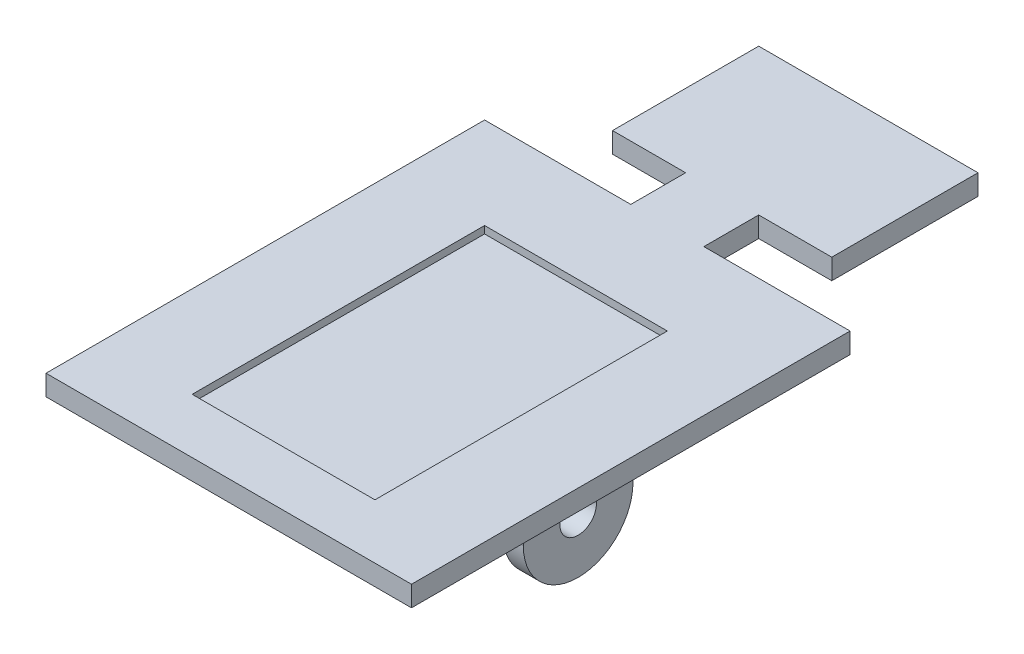
ISO-10303-21;
HEADER;
FILE_DESCRIPTION(('STEP AP214'),'2;1');
FILE_NAME('part.step','',(''),(''),'','','');
FILE_SCHEMA(('AUTOMOTIVE_DESIGN { 1 0 10303 214 1 1 1 1 }'));
ENDSEC;
DATA;
#1=APPLICATION_CONTEXT('core data for automotive mechanical design processes');
#2=APPLICATION_PROTOCOL_DEFINITION('international standard','automotive_design',2000,#1);
#3=PRODUCT_CONTEXT('',#1,'mechanical');
#4=PRODUCT('Part','Part','',(#3));
#5=PRODUCT_RELATED_PRODUCT_CATEGORY('part','',(#4));
#6=PRODUCT_DEFINITION_FORMATION('','',#4);
#7=PRODUCT_DEFINITION_CONTEXT('part definition',#1,'design');
#8=PRODUCT_DEFINITION('design','',#6,#7);
#9=PRODUCT_DEFINITION_SHAPE('','',#8);
#10=(LENGTH_UNIT() NAMED_UNIT(*) SI_UNIT(.MILLI.,.METRE.));
#11=(NAMED_UNIT(*) PLANE_ANGLE_UNIT() SI_UNIT($,.RADIAN.));
#12=(NAMED_UNIT(*) SI_UNIT($,.STERADIAN.) SOLID_ANGLE_UNIT());
#13=UNCERTAINTY_MEASURE_WITH_UNIT(LENGTH_MEASURE(1.E-05),#10,'distance_accuracy_value','');
#14=(GEOMETRIC_REPRESENTATION_CONTEXT(3) GLOBAL_UNCERTAINTY_ASSIGNED_CONTEXT((#13)) GLOBAL_UNIT_ASSIGNED_CONTEXT((#10,
#11,#12)) REPRESENTATION_CONTEXT('',''));
#15=CARTESIAN_POINT('',(0.,0.,0.));
#16=DIRECTION('',(0.,0.,1.));
#17=DIRECTION('',(1.,0.,0.));
#18=AXIS2_PLACEMENT_3D('',#15,#16,#17);
#19=CARTESIAN_POINT('',(17.8,-15.,22.5));
#20=DIRECTION('',(-1.,0.,0.));
#21=DIRECTION('',(0.,0.,1.));
#22=AXIS2_PLACEMENT_3D('',#19,#20,#21);
#23=PLANE('',#22);
#24=DIRECTION('',(0.,1.,0.));
#25=VECTOR('',#24,1.);
#26=CARTESIAN_POINT('',(17.8,-15.,37.5));
#27=LINE('',#26,#25);
#28=CARTESIAN_POINT('',(17.8,-7.5,37.5));
#29=VERTEX_POINT('',#28);
#30=CARTESIAN_POINT('',(17.8,0.,37.5));
#31=VERTEX_POINT('',#30);
#32=EDGE_CURVE('E241',#29,#31,#27,.T.);
#33=ORIENTED_EDGE('',*,*,#32,.F.);
#34=CARTESIAN_POINT('',(17.8,-7.5,30.));
#35=DIRECTION('',(-1.,0.,0.));
#36=DIRECTION('',(0.,0.,1.));
#37=AXIS2_PLACEMENT_3D('',#34,#35,#36);
#38=CIRCLE('',#37,7.5);
#39=CARTESIAN_POINT('',(17.8,-7.5,22.5));
#40=VERTEX_POINT('',#39);
#41=EDGE_CURVE('E703',#29,#40,#38,.F.);
#42=ORIENTED_EDGE('',*,*,#41,.T.);
#43=DIRECTION('',(0.,1.,0.));
#44=VECTOR('',#43,1.);
#45=CARTESIAN_POINT('',(17.8,-15.,22.5));
#46=LINE('',#45,#44);
#47=CARTESIAN_POINT('',(17.8,0.,22.5));
#48=VERTEX_POINT('',#47);
#49=EDGE_CURVE('E235',#40,#48,#46,.T.);
#50=ORIENTED_EDGE('',*,*,#49,.T.);
#51=DIRECTION('',(0.,0.,1.));
#52=VECTOR('',#51,1.);
#53=CARTESIAN_POINT('',(17.8,0.,22.5));
#54=LINE('',#53,#52);
#55=EDGE_CURVE('E218',#48,#31,#54,.T.);
#56=ORIENTED_EDGE('',*,*,#55,.T.);
#57=EDGE_LOOP('',(#33,#42,#50,#56));
#58=FACE_BOUND('',#57,.T.);
#59=CARTESIAN_POINT('',(17.8,-7.5,30.));
#60=DIRECTION('',(-1.,0.,0.));
#61=DIRECTION('',(0.,0.,1.));
#62=AXIS2_PLACEMENT_3D('',#59,#60,#61);
#63=CIRCLE('',#62,2.5);
#64=CARTESIAN_POINT('',(17.8,-7.5,32.5));
#65=VERTEX_POINT('',#64);
#66=EDGE_CURVE('E700',#65,#65,#63,.T.);
#67=ORIENTED_EDGE('',*,*,#66,.T.);
#68=EDGE_LOOP('',(#67));
#69=FACE_BOUND('',#68,.T.);
#70=ADVANCED_FACE('F33',(#58,#69),#23,.F.);
#71=CARTESIAN_POINT('',(15.,-15.,37.5));
#72=DIRECTION('',(0.,0.,-1.));
#73=DIRECTION('',(-1.,0.,0.));
#74=AXIS2_PLACEMENT_3D('',#71,#72,#73);
#75=PLANE('',#74);
#76=DIRECTION('',(1.,0.,0.));
#77=VECTOR('',#76,1.);
#78=CARTESIAN_POINT('',(-25.,-7.5,37.5));
#79=LINE('',#78,#77);
#80=CARTESIAN_POINT('',(15.,-7.5,37.5));
#81=VERTEX_POINT('',#80);
#82=EDGE_CURVE('E201',#81,#29,#79,.T.);
#83=ORIENTED_EDGE('',*,*,#82,.T.);
#84=ORIENTED_EDGE('',*,*,#32,.T.);
#85=DIRECTION('',(-1.,0.,0.));
#86=VECTOR('',#85,1.);
#87=CARTESIAN_POINT('',(15.,0.,37.5));
#88=LINE('',#87,#86);
#89=CARTESIAN_POINT('',(15.,0.,37.5));
#90=VERTEX_POINT('',#89);
#91=EDGE_CURVE('E226',#31,#90,#88,.T.);
#92=ORIENTED_EDGE('',*,*,#91,.T.);
#93=DIRECTION('',(0.,1.,0.));
#94=VECTOR('',#93,1.);
#95=CARTESIAN_POINT('',(15.,-15.,37.5));
#96=LINE('',#95,#94);
#97=EDGE_CURVE('E239',#81,#90,#96,.T.);
#98=ORIENTED_EDGE('',*,*,#97,.F.);
#99=EDGE_LOOP('',(#83,#84,#92,#98));
#100=FACE_BOUND('',#99,.T.);
#101=ADVANCED_FACE('F427',(#100),#75,.F.);
#102=CARTESIAN_POINT('',(15.,-15.,22.5));
#103=DIRECTION('',(1.,0.,0.));
#104=DIRECTION('',(0.,0.,-1.));
#105=AXIS2_PLACEMENT_3D('',#102,#103,#104);
#106=PLANE('',#105);
#107=DIRECTION('',(0.,1.,0.));
#108=VECTOR('',#107,1.);
#109=CARTESIAN_POINT('',(15.,-15.,22.5));
#110=LINE('',#109,#108);
#111=CARTESIAN_POINT('',(15.,-7.5,22.5));
#112=VERTEX_POINT('',#111);
#113=CARTESIAN_POINT('',(15.,0.,22.5));
#114=VERTEX_POINT('',#113);
#115=EDGE_CURVE('E237',#112,#114,#110,.T.);
#116=ORIENTED_EDGE('',*,*,#115,.F.);
#117=CARTESIAN_POINT('',(15.,-7.5,30.));
#118=DIRECTION('',(1.,0.,0.));
#119=DIRECTION('',(0.,0.,-1.));
#120=AXIS2_PLACEMENT_3D('',#117,#118,#119);
#121=CIRCLE('',#120,7.5);
#122=EDGE_CURVE('E49',#112,#81,#121,.F.);
#123=ORIENTED_EDGE('',*,*,#122,.T.);
#124=ORIENTED_EDGE('',*,*,#97,.T.);
#125=DIRECTION('',(0.,0.,-1.));
#126=VECTOR('',#125,1.);
#127=CARTESIAN_POINT('',(15.,0.,22.5));
#128=LINE('',#127,#126);
#129=EDGE_CURVE('E229',#90,#114,#128,.T.);
#130=ORIENTED_EDGE('',*,*,#129,.T.);
#131=EDGE_LOOP('',(#116,#123,#124,#130));
#132=FACE_BOUND('',#131,.T.);
#133=CARTESIAN_POINT('',(15.,-7.5,30.));
#134=DIRECTION('',(1.,0.,0.));
#135=DIRECTION('',(0.,0.,-1.));
#136=AXIS2_PLACEMENT_3D('',#133,#134,#135);
#137=CIRCLE('',#136,2.5);
#138=CARTESIAN_POINT('',(15.,-7.5,27.5));
#139=VERTEX_POINT('',#138);
#140=EDGE_CURVE('E697',#139,#139,#137,.T.);
#141=ORIENTED_EDGE('',*,*,#140,.T.);
#142=EDGE_LOOP('',(#141));
#143=FACE_BOUND('',#142,.T.);
#144=ADVANCED_FACE('F433',(#132,#143),#106,.F.);
#145=CARTESIAN_POINT('',(-15.,-15.,22.5));
#146=DIRECTION('',(-1.,0.,0.));
#147=DIRECTION('',(0.,0.,1.));
#148=AXIS2_PLACEMENT_3D('',#145,#146,#147);
#149=PLANE('',#148);
#150=DIRECTION('',(0.,1.,0.));
#151=VECTOR('',#150,1.);
#152=CARTESIAN_POINT('',(-15.,-15.,37.5));
#153=LINE('',#152,#151);
#154=CARTESIAN_POINT('',(-15.,-7.5,37.5));
#155=VERTEX_POINT('',#154);
#156=CARTESIAN_POINT('',(-15.,0.,37.5));
#157=VERTEX_POINT('',#156);
#158=EDGE_CURVE('E216',#155,#157,#153,.T.);
#159=ORIENTED_EDGE('',*,*,#158,.F.);
#160=CARTESIAN_POINT('',(-15.,-7.5,30.));
#161=DIRECTION('',(-1.,0.,0.));
#162=DIRECTION('',(0.,0.,1.));
#163=AXIS2_PLACEMENT_3D('',#160,#161,#162);
#164=CIRCLE('',#163,7.5);
#165=CARTESIAN_POINT('',(-15.,-7.5,22.5));
#166=VERTEX_POINT('',#165);
#167=EDGE_CURVE('E197',#155,#166,#164,.F.);
#168=ORIENTED_EDGE('',*,*,#167,.T.);
#169=DIRECTION('',(0.,1.,0.));
#170=VECTOR('',#169,1.);
#171=CARTESIAN_POINT('',(-15.,-15.,22.5));
#172=LINE('',#171,#170);
#173=CARTESIAN_POINT('',(-15.,0.,22.5));
#174=VERTEX_POINT('',#173);
#175=EDGE_CURVE('E220',#166,#174,#172,.T.);
#176=ORIENTED_EDGE('',*,*,#175,.T.);
#177=DIRECTION('',(0.,0.,1.));
#178=VECTOR('',#177,1.);
#179=CARTESIAN_POINT('',(-15.,0.,22.5));
#180=LINE('',#179,#178);
#181=EDGE_CURVE('E709',#174,#157,#180,.T.);
#182=ORIENTED_EDGE('',*,*,#181,.T.);
#183=EDGE_LOOP('',(#159,#168,#176,#182));
#184=FACE_BOUND('',#183,.T.);
#185=CARTESIAN_POINT('',(-15.,-7.5,30.));
#186=DIRECTION('',(-1.,0.,0.));
#187=DIRECTION('',(0.,0.,1.));
#188=AXIS2_PLACEMENT_3D('',#185,#186,#187);
#189=CIRCLE('',#188,2.5);
#190=CARTESIAN_POINT('',(-15.,-7.5,32.5));
#191=VERTEX_POINT('',#190);
#192=EDGE_CURVE('E695',#191,#191,#189,.T.);
#193=ORIENTED_EDGE('',*,*,#192,.T.);
#194=EDGE_LOOP('',(#193));
#195=FACE_BOUND('',#194,.T.);
#196=ADVANCED_FACE('F588',(#184,#195),#149,.F.);
#197=CARTESIAN_POINT('',(-17.8,-15.,37.5));
#198=DIRECTION('',(0.,0.,-1.));
#199=DIRECTION('',(-1.,0.,0.));
#200=AXIS2_PLACEMENT_3D('',#197,#198,#199);
#201=PLANE('',#200);
#202=CARTESIAN_POINT('',(-17.8,-7.5,37.5));
#203=VERTEX_POINT('',#202);
#204=EDGE_CURVE('E195',#203,#155,#79,.T.);
#205=ORIENTED_EDGE('',*,*,#204,.T.);
#206=ORIENTED_EDGE('',*,*,#158,.T.);
#207=DIRECTION('',(-1.,0.,0.));
#208=VECTOR('',#207,1.);
#209=CARTESIAN_POINT('',(-17.8,0.,37.5));
#210=LINE('',#209,#208);
#211=CARTESIAN_POINT('',(-17.8,0.,37.5));
#212=VERTEX_POINT('',#211);
#213=EDGE_CURVE('E214',#157,#212,#210,.T.);
#214=ORIENTED_EDGE('',*,*,#213,.T.);
#215=DIRECTION('',(0.,1.,0.));
#216=VECTOR('',#215,1.);
#217=CARTESIAN_POINT('',(-17.8,-15.,37.5));
#218=LINE('',#217,#216);
#219=EDGE_CURVE('E208',#203,#212,#218,.T.);
#220=ORIENTED_EDGE('',*,*,#219,.F.);
#221=EDGE_LOOP('',(#205,#206,#214,#220));
#222=FACE_BOUND('',#221,.T.);
#223=ADVANCED_FACE('F212',(#222),#201,.F.);
#224=CARTESIAN_POINT('',(-17.8,-15.,22.5));
#225=DIRECTION('',(1.,0.,0.));
#226=DIRECTION('',(0.,0.,-1.));
#227=AXIS2_PLACEMENT_3D('',#224,#225,#226);
#228=PLANE('',#227);
#229=DIRECTION('',(0.,1.,0.));
#230=VECTOR('',#229,1.);
#231=CARTESIAN_POINT('',(-17.8,-15.,22.5));
#232=LINE('',#231,#230);
#233=CARTESIAN_POINT('',(-17.8,-7.5,22.5));
#234=VERTEX_POINT('',#233);
#235=CARTESIAN_POINT('',(-17.8,0.,22.5));
#236=VERTEX_POINT('',#235);
#237=EDGE_CURVE('E210',#234,#236,#232,.T.);
#238=ORIENTED_EDGE('',*,*,#237,.F.);
#239=CARTESIAN_POINT('',(-17.8,-7.5,30.));
#240=DIRECTION('',(1.,0.,0.));
#241=DIRECTION('',(0.,0.,-1.));
#242=AXIS2_PLACEMENT_3D('',#239,#240,#241);
#243=CIRCLE('',#242,7.5);
#244=EDGE_CURVE('E57',#234,#203,#243,.F.);
#245=ORIENTED_EDGE('',*,*,#244,.T.);
#246=ORIENTED_EDGE('',*,*,#219,.T.);
#247=DIRECTION('',(0.,0.,-1.));
#248=VECTOR('',#247,1.);
#249=CARTESIAN_POINT('',(-17.8,0.,22.5));
#250=LINE('',#249,#248);
#251=EDGE_CURVE('E712',#212,#236,#250,.T.);
#252=ORIENTED_EDGE('',*,*,#251,.T.);
#253=EDGE_LOOP('',(#238,#245,#246,#252));
#254=FACE_BOUND('',#253,.T.);
#255=CARTESIAN_POINT('',(-17.8,-7.5,30.));
#256=DIRECTION('',(1.,0.,0.));
#257=DIRECTION('',(0.,0.,-1.));
#258=AXIS2_PLACEMENT_3D('',#255,#256,#257);
#259=CIRCLE('',#258,2.5);
#260=CARTESIAN_POINT('',(-17.8,-7.5,27.5));
#261=VERTEX_POINT('',#260);
#262=EDGE_CURVE('E37',#261,#261,#259,.T.);
#263=ORIENTED_EDGE('',*,*,#262,.T.);
#264=EDGE_LOOP('',(#263));
#265=FACE_BOUND('',#264,.T.);
#266=ADVANCED_FACE('F205',(#254,#265),#228,.F.);
#267=CARTESIAN_POINT('',(0.,0.,0.));
#268=DIRECTION('',(0.,-1.,0.));
#269=DIRECTION('',(0.,0.,-1.));
#270=AXIS2_PLACEMENT_3D('',#267,#268,#269);
#271=PLANE('',#270);
#272=DIRECTION('',(0.,0.,-1.));
#273=VECTOR('',#272,1.);
#274=CARTESIAN_POINT('',(15.,0.,-27.5));
#275=LINE('',#274,#273);
#276=CARTESIAN_POINT('',(15.,0.,-7.5));
#277=VERTEX_POINT('',#276);
#278=CARTESIAN_POINT('',(15.,0.,-27.5));
#279=VERTEX_POINT('',#278);
#280=EDGE_CURVE('E269',#277,#279,#275,.T.);
#281=ORIENTED_EDGE('',*,*,#280,.F.);
#282=DIRECTION('',(1.,0.,0.));
#283=VECTOR('',#282,1.);
#284=CARTESIAN_POINT('',(15.,0.,-7.5));
#285=LINE('',#284,#283);
#286=CARTESIAN_POINT('',(5.,0.,-7.5));
#287=VERTEX_POINT('',#286);
#288=EDGE_CURVE('E280',#287,#277,#285,.T.);
#289=ORIENTED_EDGE('',*,*,#288,.F.);
#290=DIRECTION('',(0.,0.,-1.));
#291=VECTOR('',#290,1.);
#292=CARTESIAN_POINT('',(5.,0.,-7.5));
#293=LINE('',#292,#291);
#294=CARTESIAN_POINT('',(5.,0.,0.));
#295=VERTEX_POINT('',#294);
#296=EDGE_CURVE('E323',#295,#287,#293,.T.);
#297=ORIENTED_EDGE('',*,*,#296,.F.);
#298=DIRECTION('',(-1.,0.,0.));
#299=VECTOR('',#298,1.);
#300=CARTESIAN_POINT('',(5.,0.,0.));
#301=LINE('',#300,#299);
#302=CARTESIAN_POINT('',(25.,0.,0.));
#303=VERTEX_POINT('',#302);
#304=EDGE_CURVE('E321',#303,#295,#301,.T.);
#305=ORIENTED_EDGE('',*,*,#304,.F.);
#306=DIRECTION('',(0.,0.,-1.));
#307=VECTOR('',#306,1.);
#308=CARTESIAN_POINT('',(25.,0.,0.));
#309=LINE('',#308,#307);
#310=CARTESIAN_POINT('',(25.,0.,60.));
#311=VERTEX_POINT('',#310);
#312=EDGE_CURVE('E319',#311,#303,#309,.T.);
#313=ORIENTED_EDGE('',*,*,#312,.F.);
#314=DIRECTION('',(1.,0.,0.));
#315=VECTOR('',#314,1.);
#316=CARTESIAN_POINT('',(25.,0.,60.));
#317=LINE('',#316,#315);
#318=CARTESIAN_POINT('',(-25.,0.,60.));
#319=VERTEX_POINT('',#318);
#320=EDGE_CURVE('E317',#319,#311,#317,.T.);
#321=ORIENTED_EDGE('',*,*,#320,.F.);
#322=DIRECTION('',(0.,0.,1.));
#323=VECTOR('',#322,1.);
#324=CARTESIAN_POINT('',(-25.,0.,0.));
#325=LINE('',#324,#323);
#326=CARTESIAN_POINT('',(-25.,0.,0.));
#327=VERTEX_POINT('',#326);
#328=EDGE_CURVE('E315',#327,#319,#325,.T.);
#329=ORIENTED_EDGE('',*,*,#328,.F.);
#330=DIRECTION('',(-1.,0.,0.));
#331=VECTOR('',#330,1.);
#332=CARTESIAN_POINT('',(-5.,0.,0.));
#333=LINE('',#332,#331);
#334=CARTESIAN_POINT('',(-5.,0.,0.));
#335=VERTEX_POINT('',#334);
#336=EDGE_CURVE('E313',#335,#327,#333,.T.);
#337=ORIENTED_EDGE('',*,*,#336,.F.);
#338=DIRECTION('',(0.,0.,1.));
#339=VECTOR('',#338,1.);
#340=CARTESIAN_POINT('',(-5.,0.,-7.5));
#341=LINE('',#340,#339);
#342=CARTESIAN_POINT('',(-5.,0.,-7.5));
#343=VERTEX_POINT('',#342);
#344=EDGE_CURVE('E311',#343,#335,#341,.T.);
#345=ORIENTED_EDGE('',*,*,#344,.F.);
#346=DIRECTION('',(1.,0.,0.));
#347=VECTOR('',#346,1.);
#348=CARTESIAN_POINT('',(-15.,0.,-7.5));
#349=LINE('',#348,#347);
#350=CARTESIAN_POINT('',(-15.,0.,-7.5));
#351=VERTEX_POINT('',#350);
#352=EDGE_CURVE('E309',#351,#343,#349,.T.);
#353=ORIENTED_EDGE('',*,*,#352,.F.);
#354=DIRECTION('',(0.,0.,1.));
#355=VECTOR('',#354,1.);
#356=CARTESIAN_POINT('',(-15.,0.,-27.5));
#357=LINE('',#356,#355);
#358=CARTESIAN_POINT('',(-15.,0.,-27.5));
#359=VERTEX_POINT('',#358);
#360=EDGE_CURVE('E307',#359,#351,#357,.T.);
#361=ORIENTED_EDGE('',*,*,#360,.F.);
#362=DIRECTION('',(-1.,0.,0.));
#363=VECTOR('',#362,1.);
#364=CARTESIAN_POINT('',(-15.,0.,-27.5));
#365=LINE('',#364,#363);
#366=EDGE_CURVE('E305',#279,#359,#365,.T.);
#367=ORIENTED_EDGE('',*,*,#366,.F.);
#368=EDGE_LOOP('',(#281,#289,#297,#305,#313,#321,#329,#337,#345,#353,#361,#367));
#369=FACE_BOUND('',#368,.T.);
#370=ORIENTED_EDGE('',*,*,#91,.F.);
#371=ORIENTED_EDGE('',*,*,#55,.F.);
#372=DIRECTION('',(1.,0.,0.));
#373=VECTOR('',#372,1.);
#374=CARTESIAN_POINT('',(15.,0.,22.5));
#375=LINE('',#374,#373);
#376=EDGE_CURVE('E232',#114,#48,#375,.T.);
#377=ORIENTED_EDGE('',*,*,#376,.F.);
#378=ORIENTED_EDGE('',*,*,#129,.F.);
#379=EDGE_LOOP('',(#370,#371,#377,#378));
#380=FACE_BOUND('',#379,.T.);
#381=ORIENTED_EDGE('',*,*,#213,.F.);
#382=ORIENTED_EDGE('',*,*,#181,.F.);
#383=DIRECTION('',(1.,0.,0.));
#384=VECTOR('',#383,1.);
#385=CARTESIAN_POINT('',(-17.8,0.,22.5));
#386=LINE('',#385,#384);
#387=EDGE_CURVE('E714',#236,#174,#386,.T.);
#388=ORIENTED_EDGE('',*,*,#387,.F.);
#389=ORIENTED_EDGE('',*,*,#251,.F.);
#390=EDGE_LOOP('',(#381,#382,#388,#389));
#391=FACE_BOUND('',#390,.T.);
#392=ADVANCED_FACE('F366',(#369,#380,#391),#271,.T.);
#393=CARTESIAN_POINT('',(15.,2.8,-27.5));
#394=DIRECTION('',(-1.,0.,0.));
#395=DIRECTION('',(0.,0.,1.));
#396=AXIS2_PLACEMENT_3D('',#393,#394,#395);
#397=PLANE('',#396);
#398=ORIENTED_EDGE('',*,*,#280,.T.);
#399=DIRECTION('',(0.,-1.,0.));
#400=VECTOR('',#399,1.);
#401=CARTESIAN_POINT('',(15.,2.8,-27.5));
#402=LINE('',#401,#400);
#403=CARTESIAN_POINT('',(15.,2.8,-27.5));
#404=VERTEX_POINT('',#403);
#405=EDGE_CURVE('E11',#404,#279,#402,.T.);
#406=ORIENTED_EDGE('',*,*,#405,.F.);
#407=DIRECTION('',(0.,0.,-1.));
#408=VECTOR('',#407,1.);
#409=CARTESIAN_POINT('',(15.,2.8,-27.5));
#410=LINE('',#409,#408);
#411=CARTESIAN_POINT('',(15.,2.8,-7.5));
#412=VERTEX_POINT('',#411);
#413=EDGE_CURVE('E276',#412,#404,#410,.T.);
#414=ORIENTED_EDGE('',*,*,#413,.F.);
#415=DIRECTION('',(0.,-1.,0.));
#416=VECTOR('',#415,1.);
#417=CARTESIAN_POINT('',(15.,2.8,-7.5));
#418=LINE('',#417,#416);
#419=EDGE_CURVE('E302',#412,#277,#418,.T.);
#420=ORIENTED_EDGE('',*,*,#419,.T.);
#421=EDGE_LOOP('',(#398,#406,#414,#420));
#422=FACE_BOUND('',#421,.T.);
#423=ADVANCED_FACE('F35',(#422),#397,.F.);
#424=CARTESIAN_POINT('',(-15.,2.8,-27.5));
#425=DIRECTION('',(0.,0.,1.));
#426=DIRECTION('',(1.,0.,0.));
#427=AXIS2_PLACEMENT_3D('',#424,#425,#426);
#428=PLANE('',#427);
#429=ORIENTED_EDGE('',*,*,#366,.T.);
#430=DIRECTION('',(0.,-1.,0.));
#431=VECTOR('',#430,1.);
#432=CARTESIAN_POINT('',(-15.,2.8,-27.5));
#433=LINE('',#432,#431);
#434=CARTESIAN_POINT('',(-15.,2.8,-27.5));
#435=VERTEX_POINT('',#434);
#436=EDGE_CURVE('E42',#435,#359,#433,.T.);
#437=ORIENTED_EDGE('',*,*,#436,.F.);
#438=DIRECTION('',(-1.,0.,0.));
#439=VECTOR('',#438,1.);
#440=CARTESIAN_POINT('',(-15.,2.8,-27.5));
#441=LINE('',#440,#439);
#442=EDGE_CURVE('E279',#404,#435,#441,.T.);
#443=ORIENTED_EDGE('',*,*,#442,.F.);
#444=ORIENTED_EDGE('',*,*,#405,.T.);
#445=EDGE_LOOP('',(#429,#437,#443,#444));
#446=FACE_BOUND('',#445,.T.);
#447=ADVANCED_FACE('F384',(#446),#428,.F.);
#448=CARTESIAN_POINT('',(-15.,2.8,-27.5));
#449=DIRECTION('',(1.,0.,0.));
#450=DIRECTION('',(0.,0.,-1.));
#451=AXIS2_PLACEMENT_3D('',#448,#449,#450);
#452=PLANE('',#451);
#453=ORIENTED_EDGE('',*,*,#360,.T.);
#454=DIRECTION('',(0.,-1.,0.));
#455=VECTOR('',#454,1.);
#456=CARTESIAN_POINT('',(-15.,2.8,-7.5));
#457=LINE('',#456,#455);
#458=CARTESIAN_POINT('',(-15.,2.8,-7.5));
#459=VERTEX_POINT('',#458);
#460=EDGE_CURVE('E352',#459,#351,#457,.T.);
#461=ORIENTED_EDGE('',*,*,#460,.F.);
#462=DIRECTION('',(0.,0.,1.));
#463=VECTOR('',#462,1.);
#464=CARTESIAN_POINT('',(-15.,2.8,-27.5));
#465=LINE('',#464,#463);
#466=EDGE_CURVE('E282',#435,#459,#465,.T.);
#467=ORIENTED_EDGE('',*,*,#466,.F.);
#468=ORIENTED_EDGE('',*,*,#436,.T.);
#469=EDGE_LOOP('',(#453,#461,#467,#468));
#470=FACE_BOUND('',#469,.T.);
#471=ADVANCED_FACE('F360',(#470),#452,.F.);
#472=CARTESIAN_POINT('',(-15.,2.8,-7.5));
#473=DIRECTION('',(0.,0.,-1.));
#474=DIRECTION('',(-1.,0.,0.));
#475=AXIS2_PLACEMENT_3D('',#472,#473,#474);
#476=PLANE('',#475);
#477=ORIENTED_EDGE('',*,*,#352,.T.);
#478=DIRECTION('',(0.,-1.,0.));
#479=VECTOR('',#478,1.);
#480=CARTESIAN_POINT('',(-5.,2.8,-7.5));
#481=LINE('',#480,#479);
#482=CARTESIAN_POINT('',(-5.,2.8,-7.5));
#483=VERTEX_POINT('',#482);
#484=EDGE_CURVE('E349',#483,#343,#481,.T.);
#485=ORIENTED_EDGE('',*,*,#484,.F.);
#486=DIRECTION('',(1.,0.,0.));
#487=VECTOR('',#486,1.);
#488=CARTESIAN_POINT('',(-15.,2.8,-7.5));
#489=LINE('',#488,#487);
#490=EDGE_CURVE('E284',#459,#483,#489,.T.);
#491=ORIENTED_EDGE('',*,*,#490,.F.);
#492=ORIENTED_EDGE('',*,*,#460,.T.);
#493=EDGE_LOOP('',(#477,#485,#491,#492));
#494=FACE_BOUND('',#493,.T.);
#495=ADVANCED_FACE('F372',(#494),#476,.F.);
#496=CARTESIAN_POINT('',(-5.,2.8,-7.5));
#497=DIRECTION('',(1.,0.,0.));
#498=DIRECTION('',(0.,0.,-1.));
#499=AXIS2_PLACEMENT_3D('',#496,#497,#498);
#500=PLANE('',#499);
#501=ORIENTED_EDGE('',*,*,#344,.T.);
#502=DIRECTION('',(0.,-1.,0.));
#503=VECTOR('',#502,1.);
#504=CARTESIAN_POINT('',(-5.,2.8,0.));
#505=LINE('',#504,#503);
#506=CARTESIAN_POINT('',(-5.,2.8,0.));
#507=VERTEX_POINT('',#506);
#508=EDGE_CURVE('E346',#507,#335,#505,.T.);
#509=ORIENTED_EDGE('',*,*,#508,.F.);
#510=DIRECTION('',(0.,0.,1.));
#511=VECTOR('',#510,1.);
#512=CARTESIAN_POINT('',(-5.,2.8,-7.5));
#513=LINE('',#512,#511);
#514=EDGE_CURVE('E286',#483,#507,#513,.T.);
#515=ORIENTED_EDGE('',*,*,#514,.F.);
#516=ORIENTED_EDGE('',*,*,#484,.T.);
#517=EDGE_LOOP('',(#501,#509,#515,#516));
#518=FACE_BOUND('',#517,.T.);
#519=ADVANCED_FACE('F376',(#518),#500,.F.);
#520=CARTESIAN_POINT('',(-5.,2.8,0.));
#521=DIRECTION('',(0.,0.,1.));
#522=DIRECTION('',(1.,0.,0.));
#523=AXIS2_PLACEMENT_3D('',#520,#521,#522);
#524=PLANE('',#523);
#525=ORIENTED_EDGE('',*,*,#336,.T.);
#526=DIRECTION('',(0.,-1.,0.));
#527=VECTOR('',#526,1.);
#528=CARTESIAN_POINT('',(-25.,2.8,0.));
#529=LINE('',#528,#527);
#530=CARTESIAN_POINT('',(-25.,2.8,0.));
#531=VERTEX_POINT('',#530);
#532=EDGE_CURVE('E343',#531,#327,#529,.T.);
#533=ORIENTED_EDGE('',*,*,#532,.F.);
#534=DIRECTION('',(-1.,0.,0.));
#535=VECTOR('',#534,1.);
#536=CARTESIAN_POINT('',(-5.,2.8,0.));
#537=LINE('',#536,#535);
#538=EDGE_CURVE('E288',#507,#531,#537,.T.);
#539=ORIENTED_EDGE('',*,*,#538,.F.);
#540=ORIENTED_EDGE('',*,*,#508,.T.);
#541=EDGE_LOOP('',(#525,#533,#539,#540));
#542=FACE_BOUND('',#541,.T.);
#543=ADVANCED_FACE('F417',(#542),#524,.F.);
#544=CARTESIAN_POINT('',(-25.,2.8,0.));
#545=DIRECTION('',(1.,0.,0.));
#546=DIRECTION('',(0.,0.,-1.));
#547=AXIS2_PLACEMENT_3D('',#544,#545,#546);
#548=PLANE('',#547);
#549=ORIENTED_EDGE('',*,*,#328,.T.);
#550=DIRECTION('',(0.,-1.,0.));
#551=VECTOR('',#550,1.);
#552=CARTESIAN_POINT('',(-25.,2.8,60.));
#553=LINE('',#552,#551);
#554=CARTESIAN_POINT('',(-25.,2.8,60.));
#555=VERTEX_POINT('',#554);
#556=EDGE_CURVE('E340',#555,#319,#553,.T.);
#557=ORIENTED_EDGE('',*,*,#556,.F.);
#558=DIRECTION('',(0.,0.,1.));
#559=VECTOR('',#558,1.);
#560=CARTESIAN_POINT('',(-25.,2.8,0.));
#561=LINE('',#560,#559);
#562=EDGE_CURVE('E290',#531,#555,#561,.T.);
#563=ORIENTED_EDGE('',*,*,#562,.F.);
#564=ORIENTED_EDGE('',*,*,#532,.T.);
#565=EDGE_LOOP('',(#549,#557,#563,#564));
#566=FACE_BOUND('',#565,.T.);
#567=ADVANCED_FACE('F415',(#566),#548,.F.);
#568=CARTESIAN_POINT('',(25.,2.8,60.));
#569=DIRECTION('',(0.,0.,-1.));
#570=DIRECTION('',(-1.,0.,0.));
#571=AXIS2_PLACEMENT_3D('',#568,#569,#570);
#572=PLANE('',#571);
#573=ORIENTED_EDGE('',*,*,#320,.T.);
#574=DIRECTION('',(0.,-1.,0.));
#575=VECTOR('',#574,1.);
#576=CARTESIAN_POINT('',(25.,2.8,60.));
#577=LINE('',#576,#575);
#578=CARTESIAN_POINT('',(25.,2.8,60.));
#579=VERTEX_POINT('',#578);
#580=EDGE_CURVE('E337',#579,#311,#577,.T.);
#581=ORIENTED_EDGE('',*,*,#580,.F.);
#582=DIRECTION('',(1.,0.,0.));
#583=VECTOR('',#582,1.);
#584=CARTESIAN_POINT('',(25.,2.8,60.));
#585=LINE('',#584,#583);
#586=EDGE_CURVE('E292',#555,#579,#585,.T.);
#587=ORIENTED_EDGE('',*,*,#586,.F.);
#588=ORIENTED_EDGE('',*,*,#556,.T.);
#589=EDGE_LOOP('',(#573,#581,#587,#588));
#590=FACE_BOUND('',#589,.T.);
#591=ADVANCED_FACE('F411',(#590),#572,.F.);
#592=CARTESIAN_POINT('',(25.,2.8,0.));
#593=DIRECTION('',(-1.,0.,0.));
#594=DIRECTION('',(0.,0.,1.));
#595=AXIS2_PLACEMENT_3D('',#592,#593,#594);
#596=PLANE('',#595);
#597=ORIENTED_EDGE('',*,*,#312,.T.);
#598=DIRECTION('',(0.,-1.,0.));
#599=VECTOR('',#598,1.);
#600=CARTESIAN_POINT('',(25.,2.8,0.));
#601=LINE('',#600,#599);
#602=CARTESIAN_POINT('',(25.,2.8,0.));
#603=VERTEX_POINT('',#602);
#604=EDGE_CURVE('E334',#603,#303,#601,.T.);
#605=ORIENTED_EDGE('',*,*,#604,.F.);
#606=DIRECTION('',(0.,0.,-1.));
#607=VECTOR('',#606,1.);
#608=CARTESIAN_POINT('',(25.,2.8,0.));
#609=LINE('',#608,#607);
#610=EDGE_CURVE('E294',#579,#603,#609,.T.);
#611=ORIENTED_EDGE('',*,*,#610,.F.);
#612=ORIENTED_EDGE('',*,*,#580,.T.);
#613=EDGE_LOOP('',(#597,#605,#611,#612));
#614=FACE_BOUND('',#613,.T.);
#615=ADVANCED_FACE('F406',(#614),#596,.F.);
#616=CARTESIAN_POINT('',(5.,2.8,0.));
#617=DIRECTION('',(0.,0.,1.));
#618=DIRECTION('',(1.,0.,0.));
#619=AXIS2_PLACEMENT_3D('',#616,#617,#618);
#620=PLANE('',#619);
#621=ORIENTED_EDGE('',*,*,#304,.T.);
#622=DIRECTION('',(0.,-1.,0.));
#623=VECTOR('',#622,1.);
#624=CARTESIAN_POINT('',(5.,2.8,0.));
#625=LINE('',#624,#623);
#626=CARTESIAN_POINT('',(5.,2.8,0.));
#627=VERTEX_POINT('',#626);
#628=EDGE_CURVE('E331',#627,#295,#625,.T.);
#629=ORIENTED_EDGE('',*,*,#628,.F.);
#630=DIRECTION('',(-1.,0.,0.));
#631=VECTOR('',#630,1.);
#632=CARTESIAN_POINT('',(5.,2.8,0.));
#633=LINE('',#632,#631);
#634=EDGE_CURVE('E296',#603,#627,#633,.T.);
#635=ORIENTED_EDGE('',*,*,#634,.F.);
#636=ORIENTED_EDGE('',*,*,#604,.T.);
#637=EDGE_LOOP('',(#621,#629,#635,#636));
#638=FACE_BOUND('',#637,.T.);
#639=ADVANCED_FACE('F400',(#638),#620,.F.);
#640=CARTESIAN_POINT('',(5.,2.8,-7.5));
#641=DIRECTION('',(-1.,0.,0.));
#642=DIRECTION('',(0.,0.,1.));
#643=AXIS2_PLACEMENT_3D('',#640,#641,#642);
#644=PLANE('',#643);
#645=ORIENTED_EDGE('',*,*,#296,.T.);
#646=DIRECTION('',(0.,-1.,0.));
#647=VECTOR('',#646,1.);
#648=CARTESIAN_POINT('',(5.,2.8,-7.5));
#649=LINE('',#648,#647);
#650=CARTESIAN_POINT('',(5.,2.8,-7.5));
#651=VERTEX_POINT('',#650);
#652=EDGE_CURVE('E328',#651,#287,#649,.T.);
#653=ORIENTED_EDGE('',*,*,#652,.F.);
#654=DIRECTION('',(0.,0.,-1.));
#655=VECTOR('',#654,1.);
#656=CARTESIAN_POINT('',(5.,2.8,-7.5));
#657=LINE('',#656,#655);
#658=EDGE_CURVE('E298',#627,#651,#657,.T.);
#659=ORIENTED_EDGE('',*,*,#658,.F.);
#660=ORIENTED_EDGE('',*,*,#628,.T.);
#661=EDGE_LOOP('',(#645,#653,#659,#660));
#662=FACE_BOUND('',#661,.T.);
#663=ADVANCED_FACE('F396',(#662),#644,.F.);
#664=CARTESIAN_POINT('',(15.,2.8,-7.5));
#665=DIRECTION('',(0.,0.,-1.));
#666=DIRECTION('',(-1.,0.,0.));
#667=AXIS2_PLACEMENT_3D('',#664,#665,#666);
#668=PLANE('',#667);
#669=ORIENTED_EDGE('',*,*,#288,.T.);
#670=ORIENTED_EDGE('',*,*,#419,.F.);
#671=DIRECTION('',(1.,0.,0.));
#672=VECTOR('',#671,1.);
#673=CARTESIAN_POINT('',(15.,2.8,-7.5));
#674=LINE('',#673,#672);
#675=EDGE_CURVE('E300',#651,#412,#674,.T.);
#676=ORIENTED_EDGE('',*,*,#675,.F.);
#677=ORIENTED_EDGE('',*,*,#652,.T.);
#678=EDGE_LOOP('',(#669,#670,#676,#677));
#679=FACE_BOUND('',#678,.T.);
#680=ADVANCED_FACE('F391',(#679),#668,.F.);
#681=CARTESIAN_POINT('',(0.,2.8,0.));
#682=DIRECTION('',(0.,-1.,0.));
#683=DIRECTION('',(0.,0.,-1.));
#684=AXIS2_PLACEMENT_3D('',#681,#682,#683);
#685=PLANE('',#684);
#686=DIRECTION('',(-1.,0.,0.));
#687=VECTOR('',#686,1.);
#688=CARTESIAN_POINT('',(-12.5,2.8,12.5));
#689=LINE('',#688,#687);
#690=CARTESIAN_POINT('',(12.5,2.8,12.5));
#691=VERTEX_POINT('',#690);
#692=CARTESIAN_POINT('',(-12.5,2.8,12.5));
#693=VERTEX_POINT('',#692);
#694=EDGE_CURVE('E259',#691,#693,#689,.T.);
#695=ORIENTED_EDGE('',*,*,#694,.F.);
#696=DIRECTION('',(0.,0.,-1.));
#697=VECTOR('',#696,1.);
#698=CARTESIAN_POINT('',(12.5,2.8,12.5));
#699=LINE('',#698,#697);
#700=CARTESIAN_POINT('',(12.5,2.8,52.5));
#701=VERTEX_POINT('',#700);
#702=EDGE_CURVE('E243',#701,#691,#699,.T.);
#703=ORIENTED_EDGE('',*,*,#702,.F.);
#704=DIRECTION('',(1.,0.,0.));
#705=VECTOR('',#704,1.);
#706=CARTESIAN_POINT('',(-12.5,2.8,52.5));
#707=LINE('',#706,#705);
#708=CARTESIAN_POINT('',(-12.5,2.8,52.5));
#709=VERTEX_POINT('',#708);
#710=EDGE_CURVE('E248',#709,#701,#707,.T.);
#711=ORIENTED_EDGE('',*,*,#710,.F.);
#712=DIRECTION('',(0.,0.,1.));
#713=VECTOR('',#712,1.);
#714=CARTESIAN_POINT('',(-12.5,2.8,12.5));
#715=LINE('',#714,#713);
#716=EDGE_CURVE('E262',#693,#709,#715,.T.);
#717=ORIENTED_EDGE('',*,*,#716,.F.);
#718=EDGE_LOOP('',(#695,#703,#711,#717));
#719=FACE_BOUND('',#718,.T.);
#720=ORIENTED_EDGE('',*,*,#413,.T.);
#721=ORIENTED_EDGE('',*,*,#442,.T.);
#722=ORIENTED_EDGE('',*,*,#466,.T.);
#723=ORIENTED_EDGE('',*,*,#490,.T.);
#724=ORIENTED_EDGE('',*,*,#514,.T.);
#725=ORIENTED_EDGE('',*,*,#538,.T.);
#726=ORIENTED_EDGE('',*,*,#562,.T.);
#727=ORIENTED_EDGE('',*,*,#586,.T.);
#728=ORIENTED_EDGE('',*,*,#610,.T.);
#729=ORIENTED_EDGE('',*,*,#634,.T.);
#730=ORIENTED_EDGE('',*,*,#658,.T.);
#731=ORIENTED_EDGE('',*,*,#675,.T.);
#732=EDGE_LOOP('',(#720,#721,#722,#723,#724,#725,#726,#727,#728,#729,#730,#731));
#733=FACE_BOUND('',#732,.T.);
#734=ADVANCED_FACE('F380',(#719,#733),#685,.F.);
#735=CARTESIAN_POINT('',(12.5,1.8,12.5));
#736=DIRECTION('',(1.,0.,0.));
#737=DIRECTION('',(0.,0.,-1.));
#738=AXIS2_PLACEMENT_3D('',#735,#736,#737);
#739=PLANE('',#738);
#740=ORIENTED_EDGE('',*,*,#702,.T.);
#741=DIRECTION('',(0.,1.,0.));
#742=VECTOR('',#741,1.);
#743=CARTESIAN_POINT('',(12.5,1.8,12.5));
#744=LINE('',#743,#742);
#745=CARTESIAN_POINT('',(12.5,1.8,12.5));
#746=VERTEX_POINT('',#745);
#747=EDGE_CURVE('E257',#746,#691,#744,.T.);
#748=ORIENTED_EDGE('',*,*,#747,.F.);
#749=DIRECTION('',(0.,0.,-1.));
#750=VECTOR('',#749,1.);
#751=CARTESIAN_POINT('',(12.5,1.8,12.5));
#752=LINE('',#751,#750);
#753=CARTESIAN_POINT('',(12.5,1.8,52.5));
#754=VERTEX_POINT('',#753);
#755=EDGE_CURVE('E244',#754,#746,#752,.T.);
#756=ORIENTED_EDGE('',*,*,#755,.F.);
#757=DIRECTION('',(0.,1.,0.));
#758=VECTOR('',#757,1.);
#759=CARTESIAN_POINT('',(12.5,1.8,52.5));
#760=LINE('',#759,#758);
#761=EDGE_CURVE('E267',#754,#701,#760,.T.);
#762=ORIENTED_EDGE('',*,*,#761,.T.);
#763=EDGE_LOOP('',(#740,#748,#756,#762));
#764=FACE_BOUND('',#763,.T.);
#765=ADVANCED_FACE('F450',(#764),#739,.F.);
#766=CARTESIAN_POINT('',(-12.5,1.8,52.5));
#767=DIRECTION('',(0.,0.,1.));
#768=DIRECTION('',(1.,0.,0.));
#769=AXIS2_PLACEMENT_3D('',#766,#767,#768);
#770=PLANE('',#769);
#771=ORIENTED_EDGE('',*,*,#710,.T.);
#772=ORIENTED_EDGE('',*,*,#761,.F.);
#773=DIRECTION('',(1.,0.,0.));
#774=VECTOR('',#773,1.);
#775=CARTESIAN_POINT('',(-12.5,1.8,52.5));
#776=LINE('',#775,#774);
#777=CARTESIAN_POINT('',(-12.5,1.8,52.5));
#778=VERTEX_POINT('',#777);
#779=EDGE_CURVE('E254',#778,#754,#776,.T.);
#780=ORIENTED_EDGE('',*,*,#779,.F.);
#781=DIRECTION('',(0.,1.,0.));
#782=VECTOR('',#781,1.);
#783=CARTESIAN_POINT('',(-12.5,1.8,52.5));
#784=LINE('',#783,#782);
#785=EDGE_CURVE('E270',#778,#709,#784,.T.);
#786=ORIENTED_EDGE('',*,*,#785,.T.);
#787=EDGE_LOOP('',(#771,#772,#780,#786));
#788=FACE_BOUND('',#787,.T.);
#789=ADVANCED_FACE('F446',(#788),#770,.F.);
#790=CARTESIAN_POINT('',(-12.5,1.8,12.5));
#791=DIRECTION('',(-1.,0.,0.));
#792=DIRECTION('',(0.,0.,1.));
#793=AXIS2_PLACEMENT_3D('',#790,#791,#792);
#794=PLANE('',#793);
#795=ORIENTED_EDGE('',*,*,#716,.T.);
#796=ORIENTED_EDGE('',*,*,#785,.F.);
#797=DIRECTION('',(0.,0.,1.));
#798=VECTOR('',#797,1.);
#799=CARTESIAN_POINT('',(-12.5,1.8,12.5));
#800=LINE('',#799,#798);
#801=CARTESIAN_POINT('',(-12.5,1.8,12.5));
#802=VERTEX_POINT('',#801);
#803=EDGE_CURVE('E251',#802,#778,#800,.T.);
#804=ORIENTED_EDGE('',*,*,#803,.F.);
#805=DIRECTION('',(0.,1.,0.));
#806=VECTOR('',#805,1.);
#807=CARTESIAN_POINT('',(-12.5,1.8,12.5));
#808=LINE('',#807,#806);
#809=EDGE_CURVE('E272',#802,#693,#808,.T.);
#810=ORIENTED_EDGE('',*,*,#809,.T.);
#811=EDGE_LOOP('',(#795,#796,#804,#810));
#812=FACE_BOUND('',#811,.T.);
#813=ADVANCED_FACE('F449',(#812),#794,.F.);
#814=CARTESIAN_POINT('',(-12.5,1.8,12.5));
#815=DIRECTION('',(0.,0.,-1.));
#816=DIRECTION('',(-1.,0.,0.));
#817=AXIS2_PLACEMENT_3D('',#814,#815,#816);
#818=PLANE('',#817);
#819=ORIENTED_EDGE('',*,*,#694,.T.);
#820=ORIENTED_EDGE('',*,*,#809,.F.);
#821=DIRECTION('',(-1.,0.,0.));
#822=VECTOR('',#821,1.);
#823=CARTESIAN_POINT('',(-12.5,1.8,12.5));
#824=LINE('',#823,#822);
#825=EDGE_CURVE('E247',#746,#802,#824,.T.);
#826=ORIENTED_EDGE('',*,*,#825,.F.);
#827=ORIENTED_EDGE('',*,*,#747,.T.);
#828=EDGE_LOOP('',(#819,#820,#826,#827));
#829=FACE_BOUND('',#828,.T.);
#830=ADVANCED_FACE('F444',(#829),#818,.F.);
#831=CARTESIAN_POINT('',(0.,1.8,0.));
#832=DIRECTION('',(0.,1.,0.));
#833=DIRECTION('',(0.,0.,1.));
#834=AXIS2_PLACEMENT_3D('',#831,#832,#833);
#835=PLANE('',#834);
#836=ORIENTED_EDGE('',*,*,#755,.T.);
#837=ORIENTED_EDGE('',*,*,#825,.T.);
#838=ORIENTED_EDGE('',*,*,#803,.T.);
#839=ORIENTED_EDGE('',*,*,#779,.T.);
#840=EDGE_LOOP('',(#836,#837,#838,#839));
#841=FACE_BOUND('',#840,.T.);
#842=ADVANCED_FACE('F440',(#841),#835,.T.);
#843=CARTESIAN_POINT('',(15.,-15.,22.5));
#844=DIRECTION('',(0.,0.,1.));
#845=DIRECTION('',(1.,0.,0.));
#846=AXIS2_PLACEMENT_3D('',#843,#844,#845);
#847=PLANE('',#846);
#848=ORIENTED_EDGE('',*,*,#49,.F.);
#849=DIRECTION('',(1.,0.,0.));
#850=VECTOR('',#849,1.);
#851=CARTESIAN_POINT('',(-25.,-7.5,22.5));
#852=LINE('',#851,#850);
#853=EDGE_CURVE('E721',#112,#40,#852,.T.);
#854=ORIENTED_EDGE('',*,*,#853,.F.);
#855=ORIENTED_EDGE('',*,*,#115,.T.);
#856=ORIENTED_EDGE('',*,*,#376,.T.);
#857=EDGE_LOOP('',(#848,#854,#855,#856));
#858=FACE_BOUND('',#857,.T.);
#859=ADVANCED_FACE('F443',(#858),#847,.F.);
#860=CARTESIAN_POINT('',(-17.8,-15.,22.5));
#861=DIRECTION('',(0.,0.,1.));
#862=DIRECTION('',(1.,0.,0.));
#863=AXIS2_PLACEMENT_3D('',#860,#861,#862);
#864=PLANE('',#863);
#865=ORIENTED_EDGE('',*,*,#175,.F.);
#866=EDGE_CURVE('E720',#234,#166,#852,.T.);
#867=ORIENTED_EDGE('',*,*,#866,.F.);
#868=ORIENTED_EDGE('',*,*,#237,.T.);
#869=ORIENTED_EDGE('',*,*,#387,.T.);
#870=EDGE_LOOP('',(#865,#867,#868,#869));
#871=FACE_BOUND('',#870,.T.);
#872=ADVANCED_FACE('F526',(#871),#864,.F.);
#873=CARTESIAN_POINT('',(-25.,-7.5,30.));
#874=DIRECTION('',(1.,0.,0.));
#875=DIRECTION('',(0.,0.,-1.));
#876=AXIS2_PLACEMENT_3D('',#873,#874,#875);
#877=CYLINDRICAL_SURFACE('',#876,7.5);
#878=ORIENTED_EDGE('',*,*,#204,.F.);
#879=ORIENTED_EDGE('',*,*,#244,.F.);
#880=ORIENTED_EDGE('',*,*,#866,.T.);
#881=ORIENTED_EDGE('',*,*,#167,.F.);
#882=EDGE_LOOP('',(#878,#879,#880,#881));
#883=FACE_BOUND('',#882,.T.);
#884=ADVANCED_FACE('F196',(#883),#877,.T.);
#885=CARTESIAN_POINT('',(-25.,-7.5,30.));
#886=DIRECTION('',(1.,0.,0.));
#887=DIRECTION('',(0.,0.,-1.));
#888=AXIS2_PLACEMENT_3D('',#885,#886,#887);
#889=CYLINDRICAL_SURFACE('',#888,2.5);
#890=ORIENTED_EDGE('',*,*,#262,.F.);
#891=EDGE_LOOP('',(#890));
#892=FACE_BOUND('',#891,.T.);
#893=ORIENTED_EDGE('',*,*,#192,.F.);
#894=EDGE_LOOP('',(#893));
#895=FACE_BOUND('',#894,.T.);
#896=ADVANCED_FACE('F542',(#892,#895),#889,.F.);
#897=ORIENTED_EDGE('',*,*,#82,.F.);
#898=ORIENTED_EDGE('',*,*,#122,.F.);
#899=ORIENTED_EDGE('',*,*,#853,.T.);
#900=ORIENTED_EDGE('',*,*,#41,.F.);
#901=EDGE_LOOP('',(#897,#898,#899,#900));
#902=FACE_BOUND('',#901,.T.);
#903=ADVANCED_FACE('F544',(#902),#877,.T.);
#904=ORIENTED_EDGE('',*,*,#140,.F.);
#905=EDGE_LOOP('',(#904));
#906=FACE_BOUND('',#905,.T.);
#907=ORIENTED_EDGE('',*,*,#66,.F.);
#908=EDGE_LOOP('',(#907));
#909=FACE_BOUND('',#908,.T.);
#910=ADVANCED_FACE('F552',(#906,#909),#889,.F.);
#911=CLOSED_SHELL('',(#70,#101,#144,#196,#223,#266,#392,#423,#447,#471,#495,#519,#543,#567,#591,
#615,#639,#663,#680,#734,#765,#789,#813,#830,#842,#859,#872,#884,#896,#903,#910));
#912=MANIFOLD_SOLID_BREP('B2',#911);
#913=ADVANCED_BREP_SHAPE_REPRESENTATION('',(#18,#912),#14);
#914=SHAPE_DEFINITION_REPRESENTATION(#9,#913);
ENDSEC;
END-ISO-10303-21;
